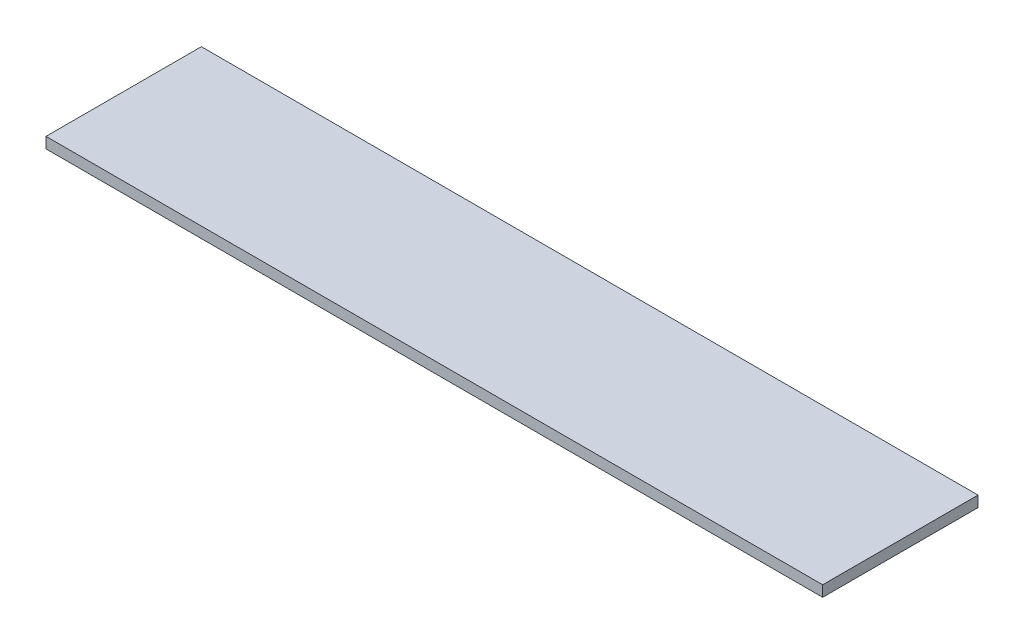
ISO-10303-21;
HEADER;
FILE_DESCRIPTION(('STEP AP214'),'2;1');
FILE_NAME('part.step','',(''),(''),'','','');
FILE_SCHEMA(('AUTOMOTIVE_DESIGN { 1 0 10303 214 1 1 1 1 }'));
ENDSEC;
DATA;
#1=APPLICATION_CONTEXT('core data for automotive mechanical design processes');
#2=APPLICATION_PROTOCOL_DEFINITION('international standard','automotive_design',2000,#1);
#3=PRODUCT_CONTEXT('',#1,'mechanical');
#4=PRODUCT('Part','Part','',(#3));
#5=PRODUCT_RELATED_PRODUCT_CATEGORY('part','',(#4));
#6=PRODUCT_DEFINITION_FORMATION('','',#4);
#7=PRODUCT_DEFINITION_CONTEXT('part definition',#1,'design');
#8=PRODUCT_DEFINITION('design','',#6,#7);
#9=PRODUCT_DEFINITION_SHAPE('','',#8);
#10=(LENGTH_UNIT() NAMED_UNIT(*) SI_UNIT(.MILLI.,.METRE.));
#11=(NAMED_UNIT(*) PLANE_ANGLE_UNIT() SI_UNIT($,.RADIAN.));
#12=(NAMED_UNIT(*) SI_UNIT($,.STERADIAN.) SOLID_ANGLE_UNIT());
#13=UNCERTAINTY_MEASURE_WITH_UNIT(LENGTH_MEASURE(1.E-05),#10,'distance_accuracy_value','');
#14=(GEOMETRIC_REPRESENTATION_CONTEXT(3) GLOBAL_UNCERTAINTY_ASSIGNED_CONTEXT((#13)) GLOBAL_UNIT_ASSIGNED_CONTEXT((#10,
#11,#12)) REPRESENTATION_CONTEXT('',''));
#15=CARTESIAN_POINT('',(0.,0.,0.));
#16=DIRECTION('',(0.,0.,1.));
#17=DIRECTION('',(1.,0.,0.));
#18=AXIS2_PLACEMENT_3D('',#15,#16,#17);
#19=CARTESIAN_POINT('',(25.,0.7,5.));
#20=DIRECTION('',(-1.,0.,0.));
#21=DIRECTION('',(0.,0.,1.));
#22=AXIS2_PLACEMENT_3D('',#19,#20,#21);
#23=PLANE('',#22);
#24=DIRECTION('',(0.,0.,-1.));
#25=VECTOR('',#24,1.);
#26=CARTESIAN_POINT('',(25.,0.,5.));
#27=LINE('',#26,#25);
#28=CARTESIAN_POINT('',(25.,0.,5.));
#29=VERTEX_POINT('',#28);
#30=CARTESIAN_POINT('',(25.,0.,-5.));
#31=VERTEX_POINT('',#30);
#32=EDGE_CURVE('E96',#29,#31,#27,.T.);
#33=ORIENTED_EDGE('',*,*,#32,.T.);
#34=DIRECTION('',(0.,-1.,0.));
#35=VECTOR('',#34,1.);
#36=CARTESIAN_POINT('',(25.,0.7,-5.));
#37=LINE('',#36,#35);
#38=CARTESIAN_POINT('',(25.,0.7,-5.));
#39=VERTEX_POINT('',#38);
#40=EDGE_CURVE('E11',#39,#31,#37,.T.);
#41=ORIENTED_EDGE('',*,*,#40,.F.);
#42=DIRECTION('',(0.,0.,-1.));
#43=VECTOR('',#42,1.);
#44=CARTESIAN_POINT('',(25.,0.7,5.));
#45=LINE('',#44,#43);
#46=CARTESIAN_POINT('',(25.,0.7,5.));
#47=VERTEX_POINT('',#46);
#48=EDGE_CURVE('E84',#47,#39,#45,.T.);
#49=ORIENTED_EDGE('',*,*,#48,.F.);
#50=DIRECTION('',(0.,-1.,0.));
#51=VECTOR('',#50,1.);
#52=CARTESIAN_POINT('',(25.,0.7,5.));
#53=LINE('',#52,#51);
#54=EDGE_CURVE('E92',#47,#29,#53,.T.);
#55=ORIENTED_EDGE('',*,*,#54,.T.);
#56=EDGE_LOOP('',(#33,#41,#49,#55));
#57=FACE_BOUND('',#56,.T.);
#58=ADVANCED_FACE('F33',(#57),#23,.F.);
#59=CARTESIAN_POINT('',(-25.,0.7,-5.));
#60=DIRECTION('',(0.,0.,1.));
#61=DIRECTION('',(1.,0.,0.));
#62=AXIS2_PLACEMENT_3D('',#59,#60,#61);
#63=PLANE('',#62);
#64=DIRECTION('',(-1.,0.,0.));
#65=VECTOR('',#64,1.);
#66=CARTESIAN_POINT('',(-25.,0.,-5.));
#67=LINE('',#66,#65);
#68=CARTESIAN_POINT('',(-25.,0.,-5.));
#69=VERTEX_POINT('',#68);
#70=EDGE_CURVE('E88',#31,#69,#67,.T.);
#71=ORIENTED_EDGE('',*,*,#70,.T.);
#72=DIRECTION('',(0.,-1.,0.));
#73=VECTOR('',#72,1.);
#74=CARTESIAN_POINT('',(-25.,0.7,-5.));
#75=LINE('',#74,#73);
#76=CARTESIAN_POINT('',(-25.,0.7,-5.));
#77=VERTEX_POINT('',#76);
#78=EDGE_CURVE('E41',#77,#69,#75,.T.);
#79=ORIENTED_EDGE('',*,*,#78,.F.);
#80=DIRECTION('',(-1.,0.,0.));
#81=VECTOR('',#80,1.);
#82=CARTESIAN_POINT('',(-25.,0.7,-5.));
#83=LINE('',#82,#81);
#84=EDGE_CURVE('E79',#39,#77,#83,.T.);
#85=ORIENTED_EDGE('',*,*,#84,.F.);
#86=ORIENTED_EDGE('',*,*,#40,.T.);
#87=EDGE_LOOP('',(#71,#79,#85,#86));
#88=FACE_BOUND('',#87,.T.);
#89=ADVANCED_FACE('F87',(#88),#63,.F.);
#90=CARTESIAN_POINT('',(-25.,0.7,5.));
#91=DIRECTION('',(1.,0.,0.));
#92=DIRECTION('',(0.,0.,-1.));
#93=AXIS2_PLACEMENT_3D('',#90,#91,#92);
#94=PLANE('',#93);
#95=DIRECTION('',(0.,0.,1.));
#96=VECTOR('',#95,1.);
#97=CARTESIAN_POINT('',(-25.,0.,5.));
#98=LINE('',#97,#96);
#99=CARTESIAN_POINT('',(-25.,0.,5.));
#100=VERTEX_POINT('',#99);
#101=EDGE_CURVE('E66',#69,#100,#98,.T.);
#102=ORIENTED_EDGE('',*,*,#101,.T.);
#103=DIRECTION('',(0.,-1.,0.));
#104=VECTOR('',#103,1.);
#105=CARTESIAN_POINT('',(-25.,0.7,5.));
#106=LINE('',#105,#104);
#107=CARTESIAN_POINT('',(-25.,0.7,5.));
#108=VERTEX_POINT('',#107);
#109=EDGE_CURVE('E89',#108,#100,#106,.T.);
#110=ORIENTED_EDGE('',*,*,#109,.F.);
#111=DIRECTION('',(0.,0.,1.));
#112=VECTOR('',#111,1.);
#113=CARTESIAN_POINT('',(-25.,0.7,5.));
#114=LINE('',#113,#112);
#115=EDGE_CURVE('E82',#77,#108,#114,.T.);
#116=ORIENTED_EDGE('',*,*,#115,.F.);
#117=ORIENTED_EDGE('',*,*,#78,.T.);
#118=EDGE_LOOP('',(#102,#110,#116,#117));
#119=FACE_BOUND('',#118,.T.);
#120=ADVANCED_FACE('F90',(#119),#94,.F.);
#121=CARTESIAN_POINT('',(-25.,0.7,5.));
#122=DIRECTION('',(0.,0.,-1.));
#123=DIRECTION('',(-1.,0.,0.));
#124=AXIS2_PLACEMENT_3D('',#121,#122,#123);
#125=PLANE('',#124);
#126=DIRECTION('',(1.,0.,0.));
#127=VECTOR('',#126,1.);
#128=CARTESIAN_POINT('',(-25.,0.,5.));
#129=LINE('',#128,#127);
#130=EDGE_CURVE('E72',#100,#29,#129,.T.);
#131=ORIENTED_EDGE('',*,*,#130,.T.);
#132=ORIENTED_EDGE('',*,*,#54,.F.);
#133=DIRECTION('',(1.,0.,0.));
#134=VECTOR('',#133,1.);
#135=CARTESIAN_POINT('',(-25.,0.7,5.));
#136=LINE('',#135,#134);
#137=EDGE_CURVE('E49',#108,#47,#136,.T.);
#138=ORIENTED_EDGE('',*,*,#137,.F.);
#139=ORIENTED_EDGE('',*,*,#109,.T.);
#140=EDGE_LOOP('',(#131,#132,#138,#139));
#141=FACE_BOUND('',#140,.T.);
#142=ADVANCED_FACE('F103',(#141),#125,.F.);
#143=CARTESIAN_POINT('',(0.,0.7,0.));
#144=DIRECTION('',(0.,-1.,0.));
#145=DIRECTION('',(0.,0.,-1.));
#146=AXIS2_PLACEMENT_3D('',#143,#144,#145);
#147=PLANE('',#146);
#148=ORIENTED_EDGE('',*,*,#48,.T.);
#149=ORIENTED_EDGE('',*,*,#84,.T.);
#150=ORIENTED_EDGE('',*,*,#115,.T.);
#151=ORIENTED_EDGE('',*,*,#137,.T.);
#152=EDGE_LOOP('',(#148,#149,#150,#151));
#153=FACE_BOUND('',#152,.T.);
#154=ADVANCED_FACE('F80',(#153),#147,.F.);
#155=CARTESIAN_POINT('',(0.,0.,0.));
#156=DIRECTION('',(0.,-1.,0.));
#157=DIRECTION('',(0.,0.,-1.));
#158=AXIS2_PLACEMENT_3D('',#155,#156,#157);
#159=PLANE('',#158);
#160=ORIENTED_EDGE('',*,*,#32,.F.);
#161=ORIENTED_EDGE('',*,*,#130,.F.);
#162=ORIENTED_EDGE('',*,*,#101,.F.);
#163=ORIENTED_EDGE('',*,*,#70,.F.);
#164=EDGE_LOOP('',(#160,#161,#162,#163));
#165=FACE_BOUND('',#164,.T.);
#166=ADVANCED_FACE('F106',(#165),#159,.T.);
#167=CLOSED_SHELL('',(#58,#89,#120,#142,#154,#166));
#168=MANIFOLD_SOLID_BREP('B2',#167);
#169=ADVANCED_BREP_SHAPE_REPRESENTATION('',(#18,#168),#14);
#170=SHAPE_DEFINITION_REPRESENTATION(#9,#169);
ENDSEC;
END-ISO-10303-21;
